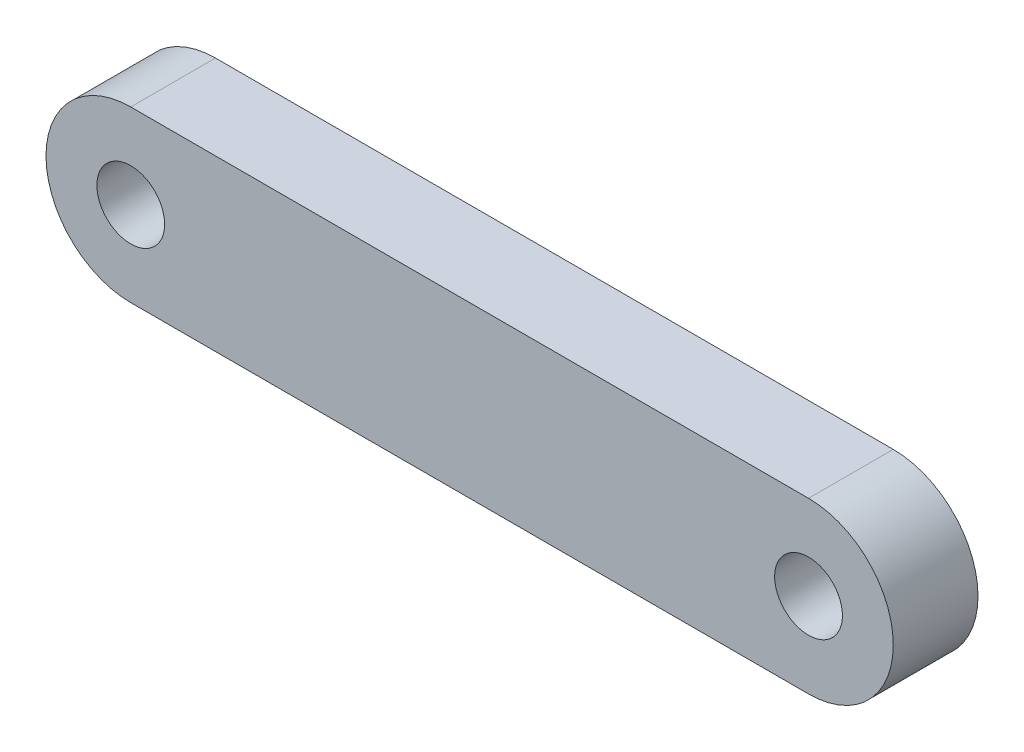
ISO-10303-21;
HEADER;
FILE_DESCRIPTION(('STEP AP214'),'2;1');
FILE_NAME('part.step','',(''),(''),'','','');
FILE_SCHEMA(('AUTOMOTIVE_DESIGN { 1 0 10303 214 1 1 1 1 }'));
ENDSEC;
DATA;
#1=APPLICATION_CONTEXT('core data for automotive mechanical design processes');
#2=APPLICATION_PROTOCOL_DEFINITION('international standard','automotive_design',2000,#1);
#3=PRODUCT_CONTEXT('',#1,'mechanical');
#4=PRODUCT('Part','Part','',(#3));
#5=PRODUCT_RELATED_PRODUCT_CATEGORY('part','',(#4));
#6=PRODUCT_DEFINITION_FORMATION('','',#4);
#7=PRODUCT_DEFINITION_CONTEXT('part definition',#1,'design');
#8=PRODUCT_DEFINITION('design','',#6,#7);
#9=PRODUCT_DEFINITION_SHAPE('','',#8);
#10=(LENGTH_UNIT() NAMED_UNIT(*) SI_UNIT(.MILLI.,.METRE.));
#11=(NAMED_UNIT(*) PLANE_ANGLE_UNIT() SI_UNIT($,.RADIAN.));
#12=(NAMED_UNIT(*) SI_UNIT($,.STERADIAN.) SOLID_ANGLE_UNIT());
#13=UNCERTAINTY_MEASURE_WITH_UNIT(LENGTH_MEASURE(1.E-05),#10,'distance_accuracy_value','');
#14=(GEOMETRIC_REPRESENTATION_CONTEXT(3) GLOBAL_UNCERTAINTY_ASSIGNED_CONTEXT((#13)) GLOBAL_UNIT_ASSIGNED_CONTEXT((#10,
#11,#12)) REPRESENTATION_CONTEXT('',''));
#15=CARTESIAN_POINT('',(0.,0.,0.));
#16=DIRECTION('',(0.,0.,1.));
#17=DIRECTION('',(1.,0.,0.));
#18=AXIS2_PLACEMENT_3D('',#15,#16,#17);
#19=CARTESIAN_POINT('',(-20.,0.,5.));
#20=DIRECTION('',(0.,0.,1.));
#21=DIRECTION('',(1.,0.,0.));
#22=AXIS2_PLACEMENT_3D('',#19,#20,#21);
#23=PLANE('',#22);
#24=CARTESIAN_POINT('',(-20.,0.,5.));
#25=DIRECTION('',(0.,0.,1.));
#26=DIRECTION('',(1.,0.,0.));
#27=AXIS2_PLACEMENT_3D('',#24,#25,#26);
#28=CIRCLE('',#27,2.);
#29=CARTESIAN_POINT('',(-18.,0.,5.));
#30=VERTEX_POINT('',#29);
#31=EDGE_CURVE('E100',#30,#30,#28,.T.);
#32=ORIENTED_EDGE('',*,*,#31,.F.);
#33=EDGE_LOOP('',(#32));
#34=FACE_BOUND('',#33,.T.);
#35=CARTESIAN_POINT('',(-20.,0.,5.));
#36=DIRECTION('',(0.,0.,1.));
#37=DIRECTION('',(1.,0.,0.));
#38=AXIS2_PLACEMENT_3D('',#35,#36,#37);
#39=CIRCLE('',#38,5.);
#40=CARTESIAN_POINT('',(-20.,5.,5.));
#41=VERTEX_POINT('',#40);
#42=CARTESIAN_POINT('',(-20.,-5.,5.));
#43=VERTEX_POINT('',#42);
#44=EDGE_CURVE('E85',#41,#43,#39,.T.);
#45=ORIENTED_EDGE('',*,*,#44,.T.);
#46=DIRECTION('',(1.,0.,0.));
#47=VECTOR('',#46,1.);
#48=CARTESIAN_POINT('',(-20.,-5.,5.));
#49=LINE('',#48,#47);
#50=CARTESIAN_POINT('',(20.,-5.,5.));
#51=VERTEX_POINT('',#50);
#52=EDGE_CURVE('E80',#43,#51,#49,.T.);
#53=ORIENTED_EDGE('',*,*,#52,.T.);
#54=CARTESIAN_POINT('',(20.,0.,5.));
#55=DIRECTION('',(0.,0.,1.));
#56=DIRECTION('',(1.,0.,0.));
#57=AXIS2_PLACEMENT_3D('',#54,#55,#56);
#58=CIRCLE('',#57,5.);
#59=CARTESIAN_POINT('',(20.,5.00000000000001,5.));
#60=VERTEX_POINT('',#59);
#61=EDGE_CURVE('E83',#51,#60,#58,.T.);
#62=ORIENTED_EDGE('',*,*,#61,.T.);
#63=DIRECTION('',(-1.,0.,0.));
#64=VECTOR('',#63,1.);
#65=CARTESIAN_POINT('',(-20.,5.,5.));
#66=LINE('',#65,#64);
#67=EDGE_CURVE('E50',#60,#41,#66,.T.);
#68=ORIENTED_EDGE('',*,*,#67,.T.);
#69=EDGE_LOOP('',(#45,#53,#62,#68));
#70=FACE_BOUND('',#69,.T.);
#71=CARTESIAN_POINT('',(20.,0.,5.));
#72=DIRECTION('',(0.,0.,1.));
#73=DIRECTION('',(1.,0.,0.));
#74=AXIS2_PLACEMENT_3D('',#71,#72,#73);
#75=CIRCLE('',#74,2.);
#76=CARTESIAN_POINT('',(22.,0.,5.));
#77=VERTEX_POINT('',#76);
#78=EDGE_CURVE('E115',#77,#77,#75,.T.);
#79=ORIENTED_EDGE('',*,*,#78,.F.);
#80=EDGE_LOOP('',(#79));
#81=FACE_BOUND('',#80,.T.);
#82=ADVANCED_FACE('F33',(#34,#70,#81),#23,.T.);
#83=CARTESIAN_POINT('',(-20.,0.,0.));
#84=DIRECTION('',(0.,0.,1.));
#85=DIRECTION('',(1.,0.,0.));
#86=AXIS2_PLACEMENT_3D('',#83,#84,#85);
#87=PLANE('',#86);
#88=CARTESIAN_POINT('',(-20.,0.,0.));
#89=DIRECTION('',(0.,0.,1.));
#90=DIRECTION('',(1.,0.,0.));
#91=AXIS2_PLACEMENT_3D('',#88,#89,#90);
#92=CIRCLE('',#91,5.);
#93=CARTESIAN_POINT('',(-20.,5.,0.));
#94=VERTEX_POINT('',#93);
#95=CARTESIAN_POINT('',(-20.,-5.,0.));
#96=VERTEX_POINT('',#95);
#97=EDGE_CURVE('E97',#94,#96,#92,.T.);
#98=ORIENTED_EDGE('',*,*,#97,.F.);
#99=DIRECTION('',(-1.,0.,0.));
#100=VECTOR('',#99,1.);
#101=CARTESIAN_POINT('',(-20.,5.,0.));
#102=LINE('',#101,#100);
#103=CARTESIAN_POINT('',(20.,5.00000000000001,0.));
#104=VERTEX_POINT('',#103);
#105=EDGE_CURVE('E73',#104,#94,#102,.T.);
#106=ORIENTED_EDGE('',*,*,#105,.F.);
#107=CARTESIAN_POINT('',(20.,0.,0.));
#108=DIRECTION('',(0.,0.,1.));
#109=DIRECTION('',(1.,0.,0.));
#110=AXIS2_PLACEMENT_3D('',#107,#108,#109);
#111=CIRCLE('',#110,5.);
#112=CARTESIAN_POINT('',(20.,-5.,0.));
#113=VERTEX_POINT('',#112);
#114=EDGE_CURVE('E67',#113,#104,#111,.T.);
#115=ORIENTED_EDGE('',*,*,#114,.F.);
#116=DIRECTION('',(1.,0.,0.));
#117=VECTOR('',#116,1.);
#118=CARTESIAN_POINT('',(-20.,-5.,0.));
#119=LINE('',#118,#117);
#120=EDGE_CURVE('E89',#96,#113,#119,.T.);
#121=ORIENTED_EDGE('',*,*,#120,.F.);
#122=EDGE_LOOP('',(#98,#106,#115,#121));
#123=FACE_BOUND('',#122,.T.);
#124=CARTESIAN_POINT('',(-20.,0.,0.));
#125=DIRECTION('',(0.,0.,1.));
#126=DIRECTION('',(1.,0.,0.));
#127=AXIS2_PLACEMENT_3D('',#124,#125,#126);
#128=CIRCLE('',#127,2.);
#129=CARTESIAN_POINT('',(-18.,0.,0.));
#130=VERTEX_POINT('',#129);
#131=EDGE_CURVE('E112',#130,#130,#128,.T.);
#132=ORIENTED_EDGE('',*,*,#131,.T.);
#133=EDGE_LOOP('',(#132));
#134=FACE_BOUND('',#133,.T.);
#135=CARTESIAN_POINT('',(20.,0.,0.));
#136=DIRECTION('',(0.,0.,1.));
#137=DIRECTION('',(1.,0.,0.));
#138=AXIS2_PLACEMENT_3D('',#135,#136,#137);
#139=CIRCLE('',#138,2.);
#140=CARTESIAN_POINT('',(22.,0.,0.));
#141=VERTEX_POINT('',#140);
#142=EDGE_CURVE('E118',#141,#141,#139,.T.);
#143=ORIENTED_EDGE('',*,*,#142,.T.);
#144=EDGE_LOOP('',(#143));
#145=FACE_BOUND('',#144,.T.);
#146=ADVANCED_FACE('F108',(#123,#134,#145),#87,.F.);
#147=CARTESIAN_POINT('',(-20.,0.,5.));
#148=DIRECTION('',(0.,0.,-1.));
#149=DIRECTION('',(-1.,0.,0.));
#150=AXIS2_PLACEMENT_3D('',#147,#148,#149);
#151=CYLINDRICAL_SURFACE('',#150,5.);
#152=ORIENTED_EDGE('',*,*,#97,.T.);
#153=DIRECTION('',(0.,0.,-1.));
#154=VECTOR('',#153,1.);
#155=CARTESIAN_POINT('',(-20.,-5.,5.));
#156=LINE('',#155,#154);
#157=EDGE_CURVE('E11',#43,#96,#156,.T.);
#158=ORIENTED_EDGE('',*,*,#157,.F.);
#159=ORIENTED_EDGE('',*,*,#44,.F.);
#160=DIRECTION('',(0.,0.,-1.));
#161=VECTOR('',#160,1.);
#162=CARTESIAN_POINT('',(-20.,5.,5.));
#163=LINE('',#162,#161);
#164=EDGE_CURVE('E93',#41,#94,#163,.T.);
#165=ORIENTED_EDGE('',*,*,#164,.T.);
#166=EDGE_LOOP('',(#152,#158,#159,#165));
#167=FACE_BOUND('',#166,.T.);
#168=ADVANCED_FACE('F35',(#167),#151,.T.);
#169=CARTESIAN_POINT('',(-20.,-5.,5.));
#170=DIRECTION('',(0.,1.,0.));
#171=DIRECTION('',(-1.,0.,0.));
#172=AXIS2_PLACEMENT_3D('',#169,#170,#171);
#173=PLANE('',#172);
#174=ORIENTED_EDGE('',*,*,#120,.T.);
#175=DIRECTION('',(0.,0.,-1.));
#176=VECTOR('',#175,1.);
#177=CARTESIAN_POINT('',(20.,-5.,5.));
#178=LINE('',#177,#176);
#179=EDGE_CURVE('E42',#51,#113,#178,.T.);
#180=ORIENTED_EDGE('',*,*,#179,.F.);
#181=ORIENTED_EDGE('',*,*,#52,.F.);
#182=ORIENTED_EDGE('',*,*,#157,.T.);
#183=EDGE_LOOP('',(#174,#180,#181,#182));
#184=FACE_BOUND('',#183,.T.);
#185=ADVANCED_FACE('F88',(#184),#173,.F.);
#186=CARTESIAN_POINT('',(20.,0.,5.));
#187=DIRECTION('',(0.,0.,-1.));
#188=DIRECTION('',(-1.,0.,0.));
#189=AXIS2_PLACEMENT_3D('',#186,#187,#188);
#190=CYLINDRICAL_SURFACE('',#189,5.);
#191=ORIENTED_EDGE('',*,*,#114,.T.);
#192=DIRECTION('',(0.,0.,-1.));
#193=VECTOR('',#192,1.);
#194=CARTESIAN_POINT('',(20.,5.00000000000001,5.));
#195=LINE('',#194,#193);
#196=EDGE_CURVE('E90',#60,#104,#195,.T.);
#197=ORIENTED_EDGE('',*,*,#196,.F.);
#198=ORIENTED_EDGE('',*,*,#61,.F.);
#199=ORIENTED_EDGE('',*,*,#179,.T.);
#200=EDGE_LOOP('',(#191,#197,#198,#199));
#201=FACE_BOUND('',#200,.T.);
#202=ADVANCED_FACE('F91',(#201),#190,.T.);
#203=CARTESIAN_POINT('',(-20.,5.,5.));
#204=DIRECTION('',(0.,-1.,0.));
#205=DIRECTION('',(1.,0.,0.));
#206=AXIS2_PLACEMENT_3D('',#203,#204,#205);
#207=PLANE('',#206);
#208=ORIENTED_EDGE('',*,*,#105,.T.);
#209=ORIENTED_EDGE('',*,*,#164,.F.);
#210=ORIENTED_EDGE('',*,*,#67,.F.);
#211=ORIENTED_EDGE('',*,*,#196,.T.);
#212=EDGE_LOOP('',(#208,#209,#210,#211));
#213=FACE_BOUND('',#212,.T.);
#214=ADVANCED_FACE('F105',(#213),#207,.F.);
#215=CARTESIAN_POINT('',(-20.,0.,5.));
#216=DIRECTION('',(0.,0.,-1.));
#217=DIRECTION('',(-1.,0.,0.));
#218=AXIS2_PLACEMENT_3D('',#215,#216,#217);
#219=CYLINDRICAL_SURFACE('',#218,2.);
#220=ORIENTED_EDGE('',*,*,#31,.T.);
#221=EDGE_LOOP('',(#220));
#222=FACE_BOUND('',#221,.T.);
#223=ORIENTED_EDGE('',*,*,#131,.F.);
#224=EDGE_LOOP('',(#223));
#225=FACE_BOUND('',#224,.T.);
#226=ADVANCED_FACE('F135',(#222,#225),#219,.F.);
#227=CARTESIAN_POINT('',(20.,0.,5.));
#228=DIRECTION('',(0.,0.,-1.));
#229=DIRECTION('',(-1.,0.,0.));
#230=AXIS2_PLACEMENT_3D('',#227,#228,#229);
#231=CYLINDRICAL_SURFACE('',#230,2.);
#232=ORIENTED_EDGE('',*,*,#78,.T.);
#233=EDGE_LOOP('',(#232));
#234=FACE_BOUND('',#233,.T.);
#235=ORIENTED_EDGE('',*,*,#142,.F.);
#236=EDGE_LOOP('',(#235));
#237=FACE_BOUND('',#236,.T.);
#238=ADVANCED_FACE('F124',(#234,#237),#231,.F.);
#239=CLOSED_SHELL('',(#82,#146,#168,#185,#202,#214,#226,#238));
#240=MANIFOLD_SOLID_BREP('B2',#239);
#241=ADVANCED_BREP_SHAPE_REPRESENTATION('',(#18,#240),#14);
#242=SHAPE_DEFINITION_REPRESENTATION(#9,#241);
ENDSEC;
END-ISO-10303-21;
